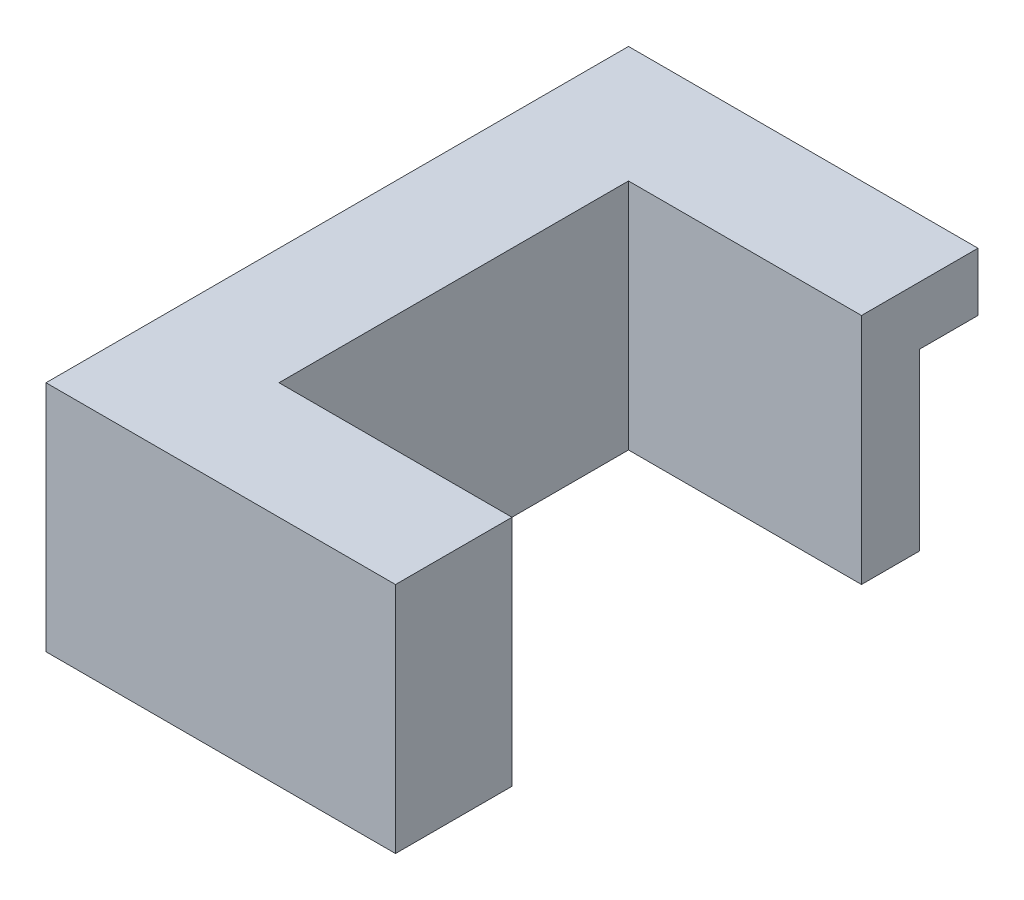
ISO-10303-21;
HEADER;
FILE_DESCRIPTION(('STEP AP214'),'2;1');
FILE_NAME('part.step','',(''),(''),'','','');
FILE_SCHEMA(('AUTOMOTIVE_DESIGN { 1 0 10303 214 1 1 1 1 }'));
ENDSEC;
DATA;
#1=APPLICATION_CONTEXT('core data for automotive mechanical design processes');
#2=APPLICATION_PROTOCOL_DEFINITION('international standard','automotive_design',2000,#1);
#3=PRODUCT_CONTEXT('',#1,'mechanical');
#4=PRODUCT('Part','Part','',(#3));
#5=PRODUCT_RELATED_PRODUCT_CATEGORY('part','',(#4));
#6=PRODUCT_DEFINITION_FORMATION('','',#4);
#7=PRODUCT_DEFINITION_CONTEXT('part definition',#1,'design');
#8=PRODUCT_DEFINITION('design','',#6,#7);
#9=PRODUCT_DEFINITION_SHAPE('','',#8);
#10=(LENGTH_UNIT() NAMED_UNIT(*) SI_UNIT(.MILLI.,.METRE.));
#11=(NAMED_UNIT(*) PLANE_ANGLE_UNIT() SI_UNIT($,.RADIAN.));
#12=(NAMED_UNIT(*) SI_UNIT($,.STERADIAN.) SOLID_ANGLE_UNIT());
#13=UNCERTAINTY_MEASURE_WITH_UNIT(LENGTH_MEASURE(1.E-05),#10,'distance_accuracy_value','');
#14=(GEOMETRIC_REPRESENTATION_CONTEXT(3) GLOBAL_UNCERTAINTY_ASSIGNED_CONTEXT((#13)) GLOBAL_UNIT_ASSIGNED_CONTEXT((#10,
#11,#12)) REPRESENTATION_CONTEXT('',''));
#15=CARTESIAN_POINT('',(0.,0.,0.));
#16=DIRECTION('',(0.,0.,1.));
#17=DIRECTION('',(1.,0.,0.));
#18=AXIS2_PLACEMENT_3D('',#15,#16,#17);
#19=CARTESIAN_POINT('',(30.,20.,0.));
#20=DIRECTION('',(0.,0.,1.));
#21=DIRECTION('',(1.,0.,0.));
#22=AXIS2_PLACEMENT_3D('',#19,#20,#21);
#23=PLANE('',#22);
#24=DIRECTION('',(0.,-1.,0.));
#25=VECTOR('',#24,1.);
#26=CARTESIAN_POINT('',(30.,20.,0.));
#27=LINE('',#26,#25);
#28=CARTESIAN_POINT('',(30.,20.,0.));
#29=VERTEX_POINT('',#28);
#30=CARTESIAN_POINT('',(30.,15.,0.));
#31=VERTEX_POINT('',#30);
#32=EDGE_CURVE('E142',#29,#31,#27,.T.);
#33=ORIENTED_EDGE('',*,*,#32,.T.);
#34=DIRECTION('',(1.,0.,0.));
#35=VECTOR('',#34,1.);
#36=CARTESIAN_POINT('',(12.,15.,0.));
#37=LINE('',#36,#35);
#38=CARTESIAN_POINT('',(12.,15.,0.));
#39=VERTEX_POINT('',#38);
#40=EDGE_CURVE('E217',#39,#31,#37,.T.);
#41=ORIENTED_EDGE('',*,*,#40,.F.);
#42=DIRECTION('',(0.,1.,0.));
#43=VECTOR('',#42,1.);
#44=CARTESIAN_POINT('',(12.,0.,0.));
#45=LINE('',#44,#43);
#46=CARTESIAN_POINT('',(12.,0.,0.));
#47=VERTEX_POINT('',#46);
#48=EDGE_CURVE('E233',#47,#39,#45,.T.);
#49=ORIENTED_EDGE('',*,*,#48,.F.);
#50=DIRECTION('',(-1.,0.,0.));
#51=VECTOR('',#50,1.);
#52=CARTESIAN_POINT('',(30.,0.,0.));
#53=LINE('',#52,#51);
#54=CARTESIAN_POINT('',(0.,0.,0.));
#55=VERTEX_POINT('',#54);
#56=EDGE_CURVE('E146',#47,#55,#53,.T.);
#57=ORIENTED_EDGE('',*,*,#56,.T.);
#58=DIRECTION('',(0.,-1.,0.));
#59=VECTOR('',#58,1.);
#60=CARTESIAN_POINT('',(0.,20.,0.));
#61=LINE('',#60,#59);
#62=CARTESIAN_POINT('',(0.,20.,0.));
#63=VERTEX_POINT('',#62);
#64=EDGE_CURVE('E11',#63,#55,#61,.T.);
#65=ORIENTED_EDGE('',*,*,#64,.F.);
#66=DIRECTION('',(-1.,0.,0.));
#67=VECTOR('',#66,1.);
#68=CARTESIAN_POINT('',(30.,20.,0.));
#69=LINE('',#68,#67);
#70=EDGE_CURVE('E170',#29,#63,#69,.T.);
#71=ORIENTED_EDGE('',*,*,#70,.F.);
#72=EDGE_LOOP('',(#33,#41,#49,#57,#65,#71));
#73=FACE_BOUND('',#72,.T.);
#74=ADVANCED_FACE('F39',(#73),#23,.F.);
#75=CARTESIAN_POINT('',(0.,20.,0.));
#76=DIRECTION('',(1.,0.,0.));
#77=DIRECTION('',(0.,0.,-1.));
#78=AXIS2_PLACEMENT_3D('',#75,#76,#77);
#79=PLANE('',#78);
#80=DIRECTION('',(0.,0.,1.));
#81=VECTOR('',#80,1.);
#82=CARTESIAN_POINT('',(0.,0.,0.));
#83=LINE('',#82,#81);
#84=CARTESIAN_POINT('',(0.,0.,50.));
#85=VERTEX_POINT('',#84);
#86=EDGE_CURVE('E149',#55,#85,#83,.T.);
#87=ORIENTED_EDGE('',*,*,#86,.T.);
#88=DIRECTION('',(0.,-1.,0.));
#89=VECTOR('',#88,1.);
#90=CARTESIAN_POINT('',(0.,20.,50.));
#91=LINE('',#90,#89);
#92=CARTESIAN_POINT('',(0.,20.,50.));
#93=VERTEX_POINT('',#92);
#94=EDGE_CURVE('E47',#93,#85,#91,.T.);
#95=ORIENTED_EDGE('',*,*,#94,.F.);
#96=DIRECTION('',(0.,0.,1.));
#97=VECTOR('',#96,1.);
#98=CARTESIAN_POINT('',(0.,20.,0.));
#99=LINE('',#98,#97);
#100=EDGE_CURVE('E102',#63,#93,#99,.T.);
#101=ORIENTED_EDGE('',*,*,#100,.F.);
#102=ORIENTED_EDGE('',*,*,#64,.T.);
#103=EDGE_LOOP('',(#87,#95,#101,#102));
#104=FACE_BOUND('',#103,.T.);
#105=ADVANCED_FACE('F271',(#104),#79,.F.);
#106=CARTESIAN_POINT('',(0.,20.,50.));
#107=DIRECTION('',(0.,0.,-1.));
#108=DIRECTION('',(-1.,0.,0.));
#109=AXIS2_PLACEMENT_3D('',#106,#107,#108);
#110=PLANE('',#109);
#111=DIRECTION('',(1.,0.,0.));
#112=VECTOR('',#111,1.);
#113=CARTESIAN_POINT('',(0.,0.,50.));
#114=LINE('',#113,#112);
#115=CARTESIAN_POINT('',(30.,0.,50.));
#116=VERTEX_POINT('',#115);
#117=EDGE_CURVE('E153',#85,#116,#114,.T.);
#118=ORIENTED_EDGE('',*,*,#117,.T.);
#119=DIRECTION('',(0.,-1.,0.));
#120=VECTOR('',#119,1.);
#121=CARTESIAN_POINT('',(30.,20.,50.));
#122=LINE('',#121,#120);
#123=CARTESIAN_POINT('',(30.,20.,50.));
#124=VERTEX_POINT('',#123);
#125=EDGE_CURVE('E182',#124,#116,#122,.T.);
#126=ORIENTED_EDGE('',*,*,#125,.F.);
#127=DIRECTION('',(1.,0.,0.));
#128=VECTOR('',#127,1.);
#129=CARTESIAN_POINT('',(0.,20.,50.));
#130=LINE('',#129,#128);
#131=EDGE_CURVE('E192',#93,#124,#130,.T.);
#132=ORIENTED_EDGE('',*,*,#131,.F.);
#133=ORIENTED_EDGE('',*,*,#94,.T.);
#134=EDGE_LOOP('',(#118,#126,#132,#133));
#135=FACE_BOUND('',#134,.T.);
#136=ADVANCED_FACE('F190',(#135),#110,.F.);
#137=CARTESIAN_POINT('',(30.,20.,50.));
#138=DIRECTION('',(-1.,0.,0.));
#139=DIRECTION('',(0.,0.,1.));
#140=AXIS2_PLACEMENT_3D('',#137,#138,#139);
#141=PLANE('',#140);
#142=DIRECTION('',(0.,0.,-1.));
#143=VECTOR('',#142,1.);
#144=CARTESIAN_POINT('',(30.,0.,50.));
#145=LINE('',#144,#143);
#146=CARTESIAN_POINT('',(30.,0.,40.));
#147=VERTEX_POINT('',#146);
#148=EDGE_CURVE('E156',#116,#147,#145,.T.);
#149=ORIENTED_EDGE('',*,*,#148,.T.);
#150=DIRECTION('',(0.,-1.,0.));
#151=VECTOR('',#150,1.);
#152=CARTESIAN_POINT('',(30.,20.,40.));
#153=LINE('',#152,#151);
#154=CARTESIAN_POINT('',(30.,20.,40.));
#155=VERTEX_POINT('',#154);
#156=EDGE_CURVE('E178',#155,#147,#153,.T.);
#157=ORIENTED_EDGE('',*,*,#156,.F.);
#158=DIRECTION('',(0.,0.,-1.));
#159=VECTOR('',#158,1.);
#160=CARTESIAN_POINT('',(30.,20.,50.));
#161=LINE('',#160,#159);
#162=EDGE_CURVE('E207',#124,#155,#161,.T.);
#163=ORIENTED_EDGE('',*,*,#162,.F.);
#164=ORIENTED_EDGE('',*,*,#125,.T.);
#165=EDGE_LOOP('',(#149,#157,#163,#164));
#166=FACE_BOUND('',#165,.T.);
#167=ADVANCED_FACE('F202',(#166),#141,.F.);
#168=CARTESIAN_POINT('',(30.,20.,40.));
#169=DIRECTION('',(0.,0.,1.));
#170=DIRECTION('',(1.,0.,0.));
#171=AXIS2_PLACEMENT_3D('',#168,#169,#170);
#172=PLANE('',#171);
#173=DIRECTION('',(-1.,0.,0.));
#174=VECTOR('',#173,1.);
#175=CARTESIAN_POINT('',(30.,0.,40.));
#176=LINE('',#175,#174);
#177=CARTESIAN_POINT('',(10.,0.,40.));
#178=VERTEX_POINT('',#177);
#179=EDGE_CURVE('E159',#147,#178,#176,.T.);
#180=ORIENTED_EDGE('',*,*,#179,.T.);
#181=DIRECTION('',(0.,-1.,0.));
#182=VECTOR('',#181,1.);
#183=CARTESIAN_POINT('',(10.,20.,40.));
#184=LINE('',#183,#182);
#185=CARTESIAN_POINT('',(10.,20.,40.));
#186=VERTEX_POINT('',#185);
#187=EDGE_CURVE('E135',#186,#178,#184,.T.);
#188=ORIENTED_EDGE('',*,*,#187,.F.);
#189=DIRECTION('',(-1.,0.,0.));
#190=VECTOR('',#189,1.);
#191=CARTESIAN_POINT('',(30.,20.,40.));
#192=LINE('',#191,#190);
#193=EDGE_CURVE('E124',#155,#186,#192,.T.);
#194=ORIENTED_EDGE('',*,*,#193,.F.);
#195=ORIENTED_EDGE('',*,*,#156,.T.);
#196=EDGE_LOOP('',(#180,#188,#194,#195));
#197=FACE_BOUND('',#196,.T.);
#198=ADVANCED_FACE('F205',(#197),#172,.F.);
#199=CARTESIAN_POINT('',(10.,20.,40.));
#200=DIRECTION('',(-1.,0.,0.));
#201=DIRECTION('',(0.,0.,1.));
#202=AXIS2_PLACEMENT_3D('',#199,#200,#201);
#203=PLANE('',#202);
#204=DIRECTION('',(0.,0.,-1.));
#205=VECTOR('',#204,1.);
#206=CARTESIAN_POINT('',(10.,0.,40.));
#207=LINE('',#206,#205);
#208=CARTESIAN_POINT('',(10.,0.,10.));
#209=VERTEX_POINT('',#208);
#210=EDGE_CURVE('E133',#178,#209,#207,.T.);
#211=ORIENTED_EDGE('',*,*,#210,.T.);
#212=DIRECTION('',(0.,-1.,0.));
#213=VECTOR('',#212,1.);
#214=CARTESIAN_POINT('',(10.,20.,10.));
#215=LINE('',#214,#213);
#216=CARTESIAN_POINT('',(10.,20.,10.));
#217=VERTEX_POINT('',#216);
#218=EDGE_CURVE('E130',#217,#209,#215,.T.);
#219=ORIENTED_EDGE('',*,*,#218,.F.);
#220=DIRECTION('',(0.,0.,-1.));
#221=VECTOR('',#220,1.);
#222=CARTESIAN_POINT('',(10.,20.,40.));
#223=LINE('',#222,#221);
#224=EDGE_CURVE('E118',#186,#217,#223,.T.);
#225=ORIENTED_EDGE('',*,*,#224,.F.);
#226=ORIENTED_EDGE('',*,*,#187,.T.);
#227=EDGE_LOOP('',(#211,#219,#225,#226));
#228=FACE_BOUND('',#227,.T.);
#229=ADVANCED_FACE('F131',(#228),#203,.F.);
#230=CARTESIAN_POINT('',(10.,20.,10.));
#231=DIRECTION('',(0.,0.,-1.));
#232=DIRECTION('',(-1.,0.,0.));
#233=AXIS2_PLACEMENT_3D('',#230,#231,#232);
#234=PLANE('',#233);
#235=DIRECTION('',(1.,0.,0.));
#236=VECTOR('',#235,1.);
#237=CARTESIAN_POINT('',(10.,0.,10.));
#238=LINE('',#237,#236);
#239=CARTESIAN_POINT('',(30.,0.,10.));
#240=VERTEX_POINT('',#239);
#241=EDGE_CURVE('E94',#209,#240,#238,.T.);
#242=ORIENTED_EDGE('',*,*,#241,.T.);
#243=DIRECTION('',(0.,-1.,0.));
#244=VECTOR('',#243,1.);
#245=CARTESIAN_POINT('',(30.,20.,10.));
#246=LINE('',#245,#244);
#247=CARTESIAN_POINT('',(30.,20.,10.));
#248=VERTEX_POINT('',#247);
#249=EDGE_CURVE('E136',#248,#240,#246,.T.);
#250=ORIENTED_EDGE('',*,*,#249,.F.);
#251=DIRECTION('',(1.,0.,0.));
#252=VECTOR('',#251,1.);
#253=CARTESIAN_POINT('',(10.,20.,10.));
#254=LINE('',#253,#252);
#255=EDGE_CURVE('E122',#217,#248,#254,.T.);
#256=ORIENTED_EDGE('',*,*,#255,.F.);
#257=ORIENTED_EDGE('',*,*,#218,.T.);
#258=EDGE_LOOP('',(#242,#250,#256,#257));
#259=FACE_BOUND('',#258,.T.);
#260=ADVANCED_FACE('F138',(#259),#234,.F.);
#261=CARTESIAN_POINT('',(30.,20.,10.));
#262=DIRECTION('',(-1.,0.,0.));
#263=DIRECTION('',(0.,0.,1.));
#264=AXIS2_PLACEMENT_3D('',#261,#262,#263);
#265=PLANE('',#264);
#266=DIRECTION('',(0.,0.,-1.));
#267=VECTOR('',#266,1.);
#268=CARTESIAN_POINT('',(30.,0.,10.));
#269=LINE('',#268,#267);
#270=CARTESIAN_POINT('',(30.,0.,5.));
#271=VERTEX_POINT('',#270);
#272=EDGE_CURVE('E166',#240,#271,#269,.T.);
#273=ORIENTED_EDGE('',*,*,#272,.T.);
#274=DIRECTION('',(0.,-1.,0.));
#275=VECTOR('',#274,1.);
#276=CARTESIAN_POINT('',(30.,0.,5.));
#277=LINE('',#276,#275);
#278=CARTESIAN_POINT('',(30.,15.,5.));
#279=VERTEX_POINT('',#278);
#280=EDGE_CURVE('E229',#279,#271,#277,.T.);
#281=ORIENTED_EDGE('',*,*,#280,.F.);
#282=DIRECTION('',(0.,0.,1.));
#283=VECTOR('',#282,1.);
#284=CARTESIAN_POINT('',(30.,15.,0.));
#285=LINE('',#284,#283);
#286=EDGE_CURVE('E234',#31,#279,#285,.T.);
#287=ORIENTED_EDGE('',*,*,#286,.F.);
#288=ORIENTED_EDGE('',*,*,#32,.F.);
#289=DIRECTION('',(0.,0.,-1.));
#290=VECTOR('',#289,1.);
#291=CARTESIAN_POINT('',(30.,20.,10.));
#292=LINE('',#291,#290);
#293=EDGE_CURVE('E63',#248,#29,#292,.T.);
#294=ORIENTED_EDGE('',*,*,#293,.F.);
#295=ORIENTED_EDGE('',*,*,#249,.T.);
#296=EDGE_LOOP('',(#273,#281,#287,#288,#294,#295));
#297=FACE_BOUND('',#296,.T.);
#298=ADVANCED_FACE('F265',(#297),#265,.F.);
#299=CARTESIAN_POINT('',(0.,20.,0.));
#300=DIRECTION('',(0.,1.,0.));
#301=DIRECTION('',(0.,0.,1.));
#302=AXIS2_PLACEMENT_3D('',#299,#300,#301);
#303=PLANE('',#302);
#304=ORIENTED_EDGE('',*,*,#70,.T.);
#305=ORIENTED_EDGE('',*,*,#100,.T.);
#306=ORIENTED_EDGE('',*,*,#131,.T.);
#307=ORIENTED_EDGE('',*,*,#162,.T.);
#308=ORIENTED_EDGE('',*,*,#193,.T.);
#309=ORIENTED_EDGE('',*,*,#224,.T.);
#310=ORIENTED_EDGE('',*,*,#255,.T.);
#311=ORIENTED_EDGE('',*,*,#293,.T.);
#312=EDGE_LOOP('',(#304,#305,#306,#307,#308,#309,#310,#311));
#313=FACE_BOUND('',#312,.T.);
#314=ADVANCED_FACE('F120',(#313),#303,.T.);
#315=CARTESIAN_POINT('',(0.,0.,0.));
#316=DIRECTION('',(0.,1.,0.));
#317=DIRECTION('',(0.,0.,1.));
#318=AXIS2_PLACEMENT_3D('',#315,#316,#317);
#319=PLANE('',#318);
#320=DIRECTION('',(0.,0.,-1.));
#321=VECTOR('',#320,1.);
#322=CARTESIAN_POINT('',(12.,0.,0.));
#323=LINE('',#322,#321);
#324=CARTESIAN_POINT('',(12.,0.,5.));
#325=VERTEX_POINT('',#324);
#326=EDGE_CURVE('E222',#325,#47,#323,.T.);
#327=ORIENTED_EDGE('',*,*,#326,.F.);
#328=DIRECTION('',(1.,0.,0.));
#329=VECTOR('',#328,1.);
#330=CARTESIAN_POINT('',(12.,0.,5.));
#331=LINE('',#330,#329);
#332=EDGE_CURVE('E150',#325,#271,#331,.T.);
#333=ORIENTED_EDGE('',*,*,#332,.T.);
#334=ORIENTED_EDGE('',*,*,#272,.F.);
#335=ORIENTED_EDGE('',*,*,#241,.F.);
#336=ORIENTED_EDGE('',*,*,#210,.F.);
#337=ORIENTED_EDGE('',*,*,#179,.F.);
#338=ORIENTED_EDGE('',*,*,#148,.F.);
#339=ORIENTED_EDGE('',*,*,#117,.F.);
#340=ORIENTED_EDGE('',*,*,#86,.F.);
#341=ORIENTED_EDGE('',*,*,#56,.F.);
#342=EDGE_LOOP('',(#327,#333,#334,#335,#336,#337,#338,#339,#340,#341));
#343=FACE_BOUND('',#342,.T.);
#344=ADVANCED_FACE('F197',(#343),#319,.F.);
#345=CARTESIAN_POINT('',(12.,0.,5.));
#346=DIRECTION('',(0.,0.,1.));
#347=DIRECTION('',(1.,0.,0.));
#348=AXIS2_PLACEMENT_3D('',#345,#346,#347);
#349=PLANE('',#348);
#350=ORIENTED_EDGE('',*,*,#280,.T.);
#351=ORIENTED_EDGE('',*,*,#332,.F.);
#352=DIRECTION('',(0.,-1.,0.));
#353=VECTOR('',#352,1.);
#354=CARTESIAN_POINT('',(12.,0.,5.));
#355=LINE('',#354,#353);
#356=CARTESIAN_POINT('',(12.,15.,5.));
#357=VERTEX_POINT('',#356);
#358=EDGE_CURVE('E54',#357,#325,#355,.T.);
#359=ORIENTED_EDGE('',*,*,#358,.F.);
#360=DIRECTION('',(1.,0.,0.));
#361=VECTOR('',#360,1.);
#362=CARTESIAN_POINT('',(12.,15.,5.));
#363=LINE('',#362,#361);
#364=EDGE_CURVE('E221',#357,#279,#363,.T.);
#365=ORIENTED_EDGE('',*,*,#364,.T.);
#366=EDGE_LOOP('',(#350,#351,#359,#365));
#367=FACE_BOUND('',#366,.T.);
#368=ADVANCED_FACE('F268',(#367),#349,.F.);
#369=CARTESIAN_POINT('',(12.,15.,0.));
#370=DIRECTION('',(0.,1.,0.));
#371=DIRECTION('',(0.,0.,1.));
#372=AXIS2_PLACEMENT_3D('',#369,#370,#371);
#373=PLANE('',#372);
#374=ORIENTED_EDGE('',*,*,#286,.T.);
#375=ORIENTED_EDGE('',*,*,#364,.F.);
#376=DIRECTION('',(0.,0.,1.));
#377=VECTOR('',#376,1.);
#378=CARTESIAN_POINT('',(12.,15.,0.));
#379=LINE('',#378,#377);
#380=EDGE_CURVE('E242',#39,#357,#379,.T.);
#381=ORIENTED_EDGE('',*,*,#380,.F.);
#382=ORIENTED_EDGE('',*,*,#40,.T.);
#383=EDGE_LOOP('',(#374,#375,#381,#382));
#384=FACE_BOUND('',#383,.T.);
#385=ADVANCED_FACE('F259',(#384),#373,.F.);
#386=CARTESIAN_POINT('',(12.,0.,0.));
#387=DIRECTION('',(1.,0.,0.));
#388=DIRECTION('',(0.,0.,-1.));
#389=AXIS2_PLACEMENT_3D('',#386,#387,#388);
#390=PLANE('',#389);
#391=ORIENTED_EDGE('',*,*,#48,.T.);
#392=ORIENTED_EDGE('',*,*,#380,.T.);
#393=ORIENTED_EDGE('',*,*,#358,.T.);
#394=ORIENTED_EDGE('',*,*,#326,.T.);
#395=EDGE_LOOP('',(#391,#392,#393,#394));
#396=FACE_BOUND('',#395,.T.);
#397=ADVANCED_FACE('F250',(#396),#390,.T.);
#398=CLOSED_SHELL('',(#74,#105,#136,#167,#198,#229,#260,#298,#314,#344,#368,#385,#397));
#399=MANIFOLD_SOLID_BREP('B2',#398);
#400=ADVANCED_BREP_SHAPE_REPRESENTATION('',(#18,#399),#14);
#401=SHAPE_DEFINITION_REPRESENTATION(#9,#400);
ENDSEC;
END-ISO-10303-21;
